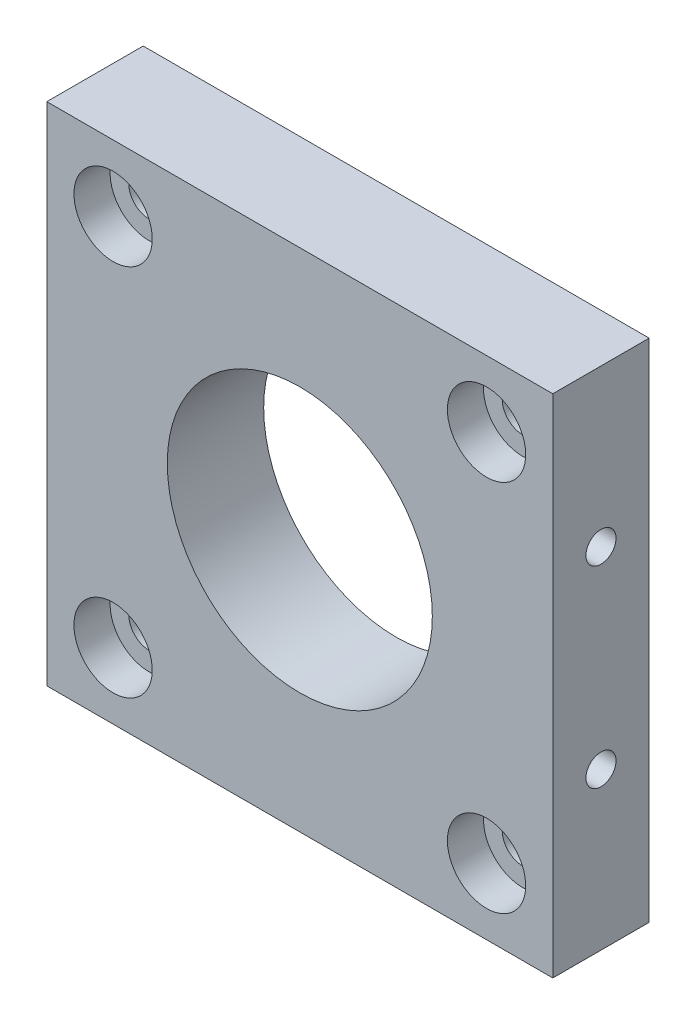
ISO-10303-21;
HEADER;
FILE_DESCRIPTION(('STEP AP214'),'2;1');
FILE_NAME('part.step','',(''),(''),'','','');
FILE_SCHEMA(('AUTOMOTIVE_DESIGN { 1 0 10303 214 1 1 1 1 }'));
ENDSEC;
DATA;
#1=APPLICATION_CONTEXT('core data for automotive mechanical design processes');
#2=APPLICATION_PROTOCOL_DEFINITION('international standard','automotive_design',2000,#1);
#3=PRODUCT_CONTEXT('',#1,'mechanical');
#4=PRODUCT('Part','Part','',(#3));
#5=PRODUCT_RELATED_PRODUCT_CATEGORY('part','',(#4));
#6=PRODUCT_DEFINITION_FORMATION('','',#4);
#7=PRODUCT_DEFINITION_CONTEXT('part definition',#1,'design');
#8=PRODUCT_DEFINITION('design','',#6,#7);
#9=PRODUCT_DEFINITION_SHAPE('','',#8);
#10=(LENGTH_UNIT() NAMED_UNIT(*) SI_UNIT(.MILLI.,.METRE.));
#11=(NAMED_UNIT(*) PLANE_ANGLE_UNIT() SI_UNIT($,.RADIAN.));
#12=(NAMED_UNIT(*) SI_UNIT($,.STERADIAN.) SOLID_ANGLE_UNIT());
#13=UNCERTAINTY_MEASURE_WITH_UNIT(LENGTH_MEASURE(1.E-05),#10,'distance_accuracy_value','');
#14=(GEOMETRIC_REPRESENTATION_CONTEXT(3) GLOBAL_UNCERTAINTY_ASSIGNED_CONTEXT((#13)) GLOBAL_UNIT_ASSIGNED_CONTEXT((#10,
#11,#12)) REPRESENTATION_CONTEXT('',''));
#15=CARTESIAN_POINT('',(0.,0.,0.));
#16=DIRECTION('',(0.,0.,1.));
#17=DIRECTION('',(1.,0.,0.));
#18=AXIS2_PLACEMENT_3D('',#15,#16,#17);
#19=CARTESIAN_POINT('',(21.,-21.,4.));
#20=DIRECTION('',(-1.,0.,0.));
#21=DIRECTION('',(0.,0.,1.));
#22=AXIS2_PLACEMENT_3D('',#19,#20,#21);
#23=PLANE('',#22);
#24=CARTESIAN_POINT('',(21.,8.,0.));
#25=DIRECTION('',(1.,0.,0.));
#26=DIRECTION('',(0.,0.,-1.));
#27=AXIS2_PLACEMENT_3D('',#24,#25,#26);
#28=CIRCLE('',#27,1.25);
#29=CARTESIAN_POINT('',(21.,8.,-1.25));
#30=VERTEX_POINT('',#29);
#31=EDGE_CURVE('E98',#30,#30,#28,.T.);
#32=ORIENTED_EDGE('',*,*,#31,.F.);
#33=EDGE_LOOP('',(#32));
#34=FACE_BOUND('',#33,.T.);
#35=CARTESIAN_POINT('',(21.,-8.,0.));
#36=DIRECTION('',(1.,0.,0.));
#37=DIRECTION('',(0.,0.,-1.));
#38=AXIS2_PLACEMENT_3D('',#35,#36,#37);
#39=CIRCLE('',#38,1.25);
#40=CARTESIAN_POINT('',(21.,-8.,-1.25));
#41=VERTEX_POINT('',#40);
#42=EDGE_CURVE('E97',#41,#41,#39,.T.);
#43=ORIENTED_EDGE('',*,*,#42,.F.);
#44=EDGE_LOOP('',(#43));
#45=FACE_BOUND('',#44,.T.);
#46=DIRECTION('',(0.,1.,0.));
#47=VECTOR('',#46,1.);
#48=CARTESIAN_POINT('',(21.,-21.,-4.));
#49=LINE('',#48,#47);
#50=CARTESIAN_POINT('',(21.,-21.,-4.));
#51=VERTEX_POINT('',#50);
#52=CARTESIAN_POINT('',(21.,21.,-4.));
#53=VERTEX_POINT('',#52);
#54=EDGE_CURVE('E160',#51,#53,#49,.T.);
#55=ORIENTED_EDGE('',*,*,#54,.T.);
#56=DIRECTION('',(0.,0.,-1.));
#57=VECTOR('',#56,1.);
#58=CARTESIAN_POINT('',(21.,21.,4.));
#59=LINE('',#58,#57);
#60=CARTESIAN_POINT('',(21.,21.,4.));
#61=VERTEX_POINT('',#60);
#62=EDGE_CURVE('E11',#61,#53,#59,.T.);
#63=ORIENTED_EDGE('',*,*,#62,.F.);
#64=DIRECTION('',(0.,1.,0.));
#65=VECTOR('',#64,1.);
#66=CARTESIAN_POINT('',(21.,-21.,4.));
#67=LINE('',#66,#65);
#68=CARTESIAN_POINT('',(21.,-21.,4.));
#69=VERTEX_POINT('',#68);
#70=EDGE_CURVE('E163',#69,#61,#67,.T.);
#71=ORIENTED_EDGE('',*,*,#70,.F.);
#72=DIRECTION('',(0.,0.,-1.));
#73=VECTOR('',#72,1.);
#74=CARTESIAN_POINT('',(21.,-21.,4.));
#75=LINE('',#74,#73);
#76=EDGE_CURVE('E169',#69,#51,#75,.T.);
#77=ORIENTED_EDGE('',*,*,#76,.T.);
#78=EDGE_LOOP('',(#55,#63,#71,#77));
#79=FACE_BOUND('',#78,.T.);
#80=ADVANCED_FACE('F33',(#34,#45,#79),#23,.F.);
#81=CARTESIAN_POINT('',(-21.,21.,4.));
#82=DIRECTION('',(0.,-1.,0.));
#83=DIRECTION('',(0.,0.,-1.));
#84=AXIS2_PLACEMENT_3D('',#81,#82,#83);
#85=PLANE('',#84);
#86=DIRECTION('',(-1.,0.,0.));
#87=VECTOR('',#86,1.);
#88=CARTESIAN_POINT('',(-21.,21.,-4.));
#89=LINE('',#88,#87);
#90=CARTESIAN_POINT('',(-21.,21.,-4.));
#91=VERTEX_POINT('',#90);
#92=EDGE_CURVE('E172',#53,#91,#89,.T.);
#93=ORIENTED_EDGE('',*,*,#92,.T.);
#94=DIRECTION('',(0.,0.,-1.));
#95=VECTOR('',#94,1.);
#96=CARTESIAN_POINT('',(-21.,21.,4.));
#97=LINE('',#96,#95);
#98=CARTESIAN_POINT('',(-21.,21.,4.));
#99=VERTEX_POINT('',#98);
#100=EDGE_CURVE('E41',#99,#91,#97,.T.);
#101=ORIENTED_EDGE('',*,*,#100,.F.);
#102=DIRECTION('',(-1.,0.,0.));
#103=VECTOR('',#102,1.);
#104=CARTESIAN_POINT('',(-21.,21.,4.));
#105=LINE('',#104,#103);
#106=EDGE_CURVE('E80',#61,#99,#105,.T.);
#107=ORIENTED_EDGE('',*,*,#106,.F.);
#108=ORIENTED_EDGE('',*,*,#62,.T.);
#109=EDGE_LOOP('',(#93,#101,#107,#108));
#110=FACE_BOUND('',#109,.T.);
#111=ADVANCED_FACE('F196',(#110),#85,.F.);
#112=CARTESIAN_POINT('',(-21.,-21.,4.));
#113=DIRECTION('',(1.,0.,0.));
#114=DIRECTION('',(0.,0.,-1.));
#115=AXIS2_PLACEMENT_3D('',#112,#113,#114);
#116=PLANE('',#115);
#117=DIRECTION('',(0.,-1.,0.));
#118=VECTOR('',#117,1.);
#119=CARTESIAN_POINT('',(-21.,-21.,-4.));
#120=LINE('',#119,#118);
#121=CARTESIAN_POINT('',(-21.,-21.,-4.));
#122=VERTEX_POINT('',#121);
#123=EDGE_CURVE('E67',#91,#122,#120,.T.);
#124=ORIENTED_EDGE('',*,*,#123,.T.);
#125=DIRECTION('',(0.,0.,-1.));
#126=VECTOR('',#125,1.);
#127=CARTESIAN_POINT('',(-21.,-21.,4.));
#128=LINE('',#127,#126);
#129=CARTESIAN_POINT('',(-21.,-21.,4.));
#130=VERTEX_POINT('',#129);
#131=EDGE_CURVE('E177',#130,#122,#128,.T.);
#132=ORIENTED_EDGE('',*,*,#131,.F.);
#133=DIRECTION('',(0.,-1.,0.));
#134=VECTOR('',#133,1.);
#135=CARTESIAN_POINT('',(-21.,-21.,4.));
#136=LINE('',#135,#134);
#137=EDGE_CURVE('E166',#99,#130,#136,.T.);
#138=ORIENTED_EDGE('',*,*,#137,.F.);
#139=ORIENTED_EDGE('',*,*,#100,.T.);
#140=EDGE_LOOP('',(#124,#132,#138,#139));
#141=FACE_BOUND('',#140,.T.);
#142=ADVANCED_FACE('F179',(#141),#116,.F.);
#143=CARTESIAN_POINT('',(-21.,-21.,4.));
#144=DIRECTION('',(0.,1.,0.));
#145=DIRECTION('',(0.,0.,1.));
#146=AXIS2_PLACEMENT_3D('',#143,#144,#145);
#147=PLANE('',#146);
#148=DIRECTION('',(1.,0.,0.));
#149=VECTOR('',#148,1.);
#150=CARTESIAN_POINT('',(-21.,-21.,-4.));
#151=LINE('',#150,#149);
#152=EDGE_CURVE('E73',#122,#51,#151,.T.);
#153=ORIENTED_EDGE('',*,*,#152,.T.);
#154=ORIENTED_EDGE('',*,*,#76,.F.);
#155=DIRECTION('',(1.,0.,0.));
#156=VECTOR('',#155,1.);
#157=CARTESIAN_POINT('',(-21.,-21.,4.));
#158=LINE('',#157,#156);
#159=EDGE_CURVE('E49',#130,#69,#158,.T.);
#160=ORIENTED_EDGE('',*,*,#159,.F.);
#161=ORIENTED_EDGE('',*,*,#131,.T.);
#162=EDGE_LOOP('',(#153,#154,#160,#161));
#163=FACE_BOUND('',#162,.T.);
#164=ADVANCED_FACE('F186',(#163),#147,.F.);
#165=CARTESIAN_POINT('',(0.,0.,4.));
#166=DIRECTION('',(0.,0.,-1.));
#167=DIRECTION('',(-1.,0.,0.));
#168=AXIS2_PLACEMENT_3D('',#165,#166,#167);
#169=PLANE('',#168);
#170=CARTESIAN_POINT('',(-15.4999999999999,-15.5000000000001,4.));
#171=DIRECTION('',(0.,0.,1.));
#172=DIRECTION('',(0.,1.,0.));
#173=AXIS2_PLACEMENT_3D('',#170,#171,#172);
#174=CIRCLE('',#173,3.25);
#175=CARTESIAN_POINT('',(-15.5,-12.2500000000001,4.));
#176=VERTEX_POINT('',#175);
#177=EDGE_CURVE('E109',#176,#176,#174,.T.);
#178=ORIENTED_EDGE('',*,*,#177,.F.);
#179=EDGE_LOOP('',(#178));
#180=FACE_BOUND('',#179,.T.);
#181=CARTESIAN_POINT('',(15.5,-15.5,4.));
#182=DIRECTION('',(0.,0.,1.));
#183=DIRECTION('',(-1.,0.,0.));
#184=AXIS2_PLACEMENT_3D('',#181,#182,#183);
#185=CIRCLE('',#184,3.25);
#186=CARTESIAN_POINT('',(12.25,-15.5,4.));
#187=VERTEX_POINT('',#186);
#188=EDGE_CURVE('E123',#187,#187,#185,.T.);
#189=ORIENTED_EDGE('',*,*,#188,.F.);
#190=EDGE_LOOP('',(#189));
#191=FACE_BOUND('',#190,.T.);
#192=CARTESIAN_POINT('',(15.4999999999998,15.5000000000002,4.));
#193=DIRECTION('',(0.,0.,1.));
#194=DIRECTION('',(0.,-1.,0.));
#195=AXIS2_PLACEMENT_3D('',#192,#193,#194);
#196=CIRCLE('',#195,3.25);
#197=CARTESIAN_POINT('',(15.4999999999999,12.2500000000002,4.));
#198=VERTEX_POINT('',#197);
#199=EDGE_CURVE('E108',#198,#198,#196,.T.);
#200=ORIENTED_EDGE('',*,*,#199,.F.);
#201=EDGE_LOOP('',(#200));
#202=FACE_BOUND('',#201,.T.);
#203=CARTESIAN_POINT('',(-15.5,15.5,4.));
#204=DIRECTION('',(0.,0.,1.));
#205=DIRECTION('',(1.,0.,0.));
#206=AXIS2_PLACEMENT_3D('',#203,#204,#205);
#207=CIRCLE('',#206,3.25);
#208=CARTESIAN_POINT('',(-12.25,15.5,4.));
#209=VERTEX_POINT('',#208);
#210=EDGE_CURVE('E122',#209,#209,#207,.T.);
#211=ORIENTED_EDGE('',*,*,#210,.F.);
#212=EDGE_LOOP('',(#211));
#213=FACE_BOUND('',#212,.T.);
#214=CARTESIAN_POINT('',(0.,0.,4.));
#215=DIRECTION('',(0.,0.,1.));
#216=DIRECTION('',(1.,0.,0.));
#217=AXIS2_PLACEMENT_3D('',#214,#215,#216);
#218=CIRCLE('',#217,11.);
#219=CARTESIAN_POINT('',(11.,0.,4.));
#220=VERTEX_POINT('',#219);
#221=EDGE_CURVE('E156',#220,#220,#218,.T.);
#222=ORIENTED_EDGE('',*,*,#221,.F.);
#223=EDGE_LOOP('',(#222));
#224=FACE_BOUND('',#223,.T.);
#225=ORIENTED_EDGE('',*,*,#70,.T.);
#226=ORIENTED_EDGE('',*,*,#106,.T.);
#227=ORIENTED_EDGE('',*,*,#137,.T.);
#228=ORIENTED_EDGE('',*,*,#159,.T.);
#229=EDGE_LOOP('',(#225,#226,#227,#228));
#230=FACE_BOUND('',#229,.T.);
#231=ADVANCED_FACE('F188',(#180,#191,#202,#213,#224,#230),#169,.F.);
#232=CARTESIAN_POINT('',(0.,0.,-4.));
#233=DIRECTION('',(0.,0.,-1.));
#234=DIRECTION('',(-1.,0.,0.));
#235=AXIS2_PLACEMENT_3D('',#232,#233,#234);
#236=PLANE('',#235);
#237=CARTESIAN_POINT('',(-15.4999999999999,-15.5000000000001,-4.));
#238=DIRECTION('',(0.,0.,1.));
#239=DIRECTION('',(0.,1.,0.));
#240=AXIS2_PLACEMENT_3D('',#237,#238,#239);
#241=CIRCLE('',#240,1.7);
#242=CARTESIAN_POINT('',(-15.5,-13.8000000000001,-4.));
#243=VERTEX_POINT('',#242);
#244=EDGE_CURVE('E112',#243,#243,#241,.T.);
#245=ORIENTED_EDGE('',*,*,#244,.T.);
#246=EDGE_LOOP('',(#245));
#247=FACE_BOUND('',#246,.T.);
#248=CARTESIAN_POINT('',(15.5,-15.5,-4.));
#249=DIRECTION('',(0.,0.,1.));
#250=DIRECTION('',(-1.,0.,0.));
#251=AXIS2_PLACEMENT_3D('',#248,#249,#250);
#252=CIRCLE('',#251,1.7);
#253=CARTESIAN_POINT('',(13.8,-15.5,-4.));
#254=VERTEX_POINT('',#253);
#255=EDGE_CURVE('E126',#254,#254,#252,.T.);
#256=ORIENTED_EDGE('',*,*,#255,.T.);
#257=EDGE_LOOP('',(#256));
#258=FACE_BOUND('',#257,.T.);
#259=CARTESIAN_POINT('',(15.4999999999998,15.5000000000002,-4.));
#260=DIRECTION('',(0.,0.,1.));
#261=DIRECTION('',(0.,-1.,0.));
#262=AXIS2_PLACEMENT_3D('',#259,#260,#261);
#263=CIRCLE('',#262,1.7);
#264=CARTESIAN_POINT('',(15.4999999999999,13.8000000000002,-4.));
#265=VERTEX_POINT('',#264);
#266=EDGE_CURVE('E137',#265,#265,#263,.T.);
#267=ORIENTED_EDGE('',*,*,#266,.T.);
#268=EDGE_LOOP('',(#267));
#269=FACE_BOUND('',#268,.T.);
#270=CARTESIAN_POINT('',(-15.5,15.5,-4.));
#271=DIRECTION('',(0.,0.,1.));
#272=DIRECTION('',(1.,0.,0.));
#273=AXIS2_PLACEMENT_3D('',#270,#271,#272);
#274=CIRCLE('',#273,1.7);
#275=CARTESIAN_POINT('',(-13.8,15.5,-4.));
#276=VERTEX_POINT('',#275);
#277=EDGE_CURVE('E153',#276,#276,#274,.T.);
#278=ORIENTED_EDGE('',*,*,#277,.T.);
#279=EDGE_LOOP('',(#278));
#280=FACE_BOUND('',#279,.T.);
#281=CARTESIAN_POINT('',(0.,0.,-4.));
#282=DIRECTION('',(0.,0.,1.));
#283=DIRECTION('',(1.,0.,0.));
#284=AXIS2_PLACEMENT_3D('',#281,#282,#283);
#285=CIRCLE('',#284,11.);
#286=CARTESIAN_POINT('',(11.,0.,-4.));
#287=VERTEX_POINT('',#286);
#288=EDGE_CURVE('E157',#287,#287,#285,.T.);
#289=ORIENTED_EDGE('',*,*,#288,.T.);
#290=EDGE_LOOP('',(#289));
#291=FACE_BOUND('',#290,.T.);
#292=ORIENTED_EDGE('',*,*,#54,.F.);
#293=ORIENTED_EDGE('',*,*,#152,.F.);
#294=ORIENTED_EDGE('',*,*,#123,.F.);
#295=ORIENTED_EDGE('',*,*,#92,.F.);
#296=EDGE_LOOP('',(#292,#293,#294,#295));
#297=FACE_BOUND('',#296,.T.);
#298=ADVANCED_FACE('F182',(#247,#258,#269,#280,#291,#297),#236,.T.);
#299=CARTESIAN_POINT('',(0.,0.,-4.));
#300=DIRECTION('',(0.,0.,1.));
#301=DIRECTION('',(1.,0.,0.));
#302=AXIS2_PLACEMENT_3D('',#299,#300,#301);
#303=CYLINDRICAL_SURFACE('',#302,11.);
#304=ORIENTED_EDGE('',*,*,#288,.F.);
#305=EDGE_LOOP('',(#304));
#306=FACE_BOUND('',#305,.T.);
#307=ORIENTED_EDGE('',*,*,#221,.T.);
#308=EDGE_LOOP('',(#307));
#309=FACE_BOUND('',#308,.T.);
#310=ADVANCED_FACE('F267',(#306,#309),#303,.F.);
#311=CARTESIAN_POINT('',(-15.5,15.5,4.));
#312=DIRECTION('',(0.,0.,1.));
#313=DIRECTION('',(1.,0.,0.));
#314=AXIS2_PLACEMENT_3D('',#311,#312,#313);
#315=CYLINDRICAL_SURFACE('',#314,1.7);
#316=ORIENTED_EDGE('',*,*,#277,.F.);
#317=EDGE_LOOP('',(#316));
#318=FACE_BOUND('',#317,.T.);
#319=CARTESIAN_POINT('',(-15.5,15.5,1.));
#320=DIRECTION('',(0.,0.,1.));
#321=DIRECTION('',(1.,0.,0.));
#322=AXIS2_PLACEMENT_3D('',#319,#320,#321);
#323=CIRCLE('',#322,1.7);
#324=CARTESIAN_POINT('',(-13.8,15.5,1.));
#325=VERTEX_POINT('',#324);
#326=EDGE_CURVE('E150',#325,#325,#323,.T.);
#327=ORIENTED_EDGE('',*,*,#326,.T.);
#328=EDGE_LOOP('',(#327));
#329=FACE_BOUND('',#328,.T.);
#330=ADVANCED_FACE('F263',(#318,#329),#315,.F.);
#331=CARTESIAN_POINT('',(-13.8,15.5,1.));
#332=DIRECTION('',(0.,0.,-1.));
#333=DIRECTION('',(-1.,0.,0.));
#334=AXIS2_PLACEMENT_3D('',#331,#332,#333);
#335=PLANE('',#334);
#336=ORIENTED_EDGE('',*,*,#326,.F.);
#337=EDGE_LOOP('',(#336));
#338=FACE_BOUND('',#337,.T.);
#339=CARTESIAN_POINT('',(-15.5,15.5,1.));
#340=DIRECTION('',(0.,0.,1.));
#341=DIRECTION('',(1.,0.,0.));
#342=AXIS2_PLACEMENT_3D('',#339,#340,#341);
#343=CIRCLE('',#342,3.25);
#344=CARTESIAN_POINT('',(-12.25,15.5,1.));
#345=VERTEX_POINT('',#344);
#346=EDGE_CURVE('E147',#345,#345,#343,.T.);
#347=ORIENTED_EDGE('',*,*,#346,.T.);
#348=EDGE_LOOP('',(#347));
#349=FACE_BOUND('',#348,.T.);
#350=ADVANCED_FACE('F259',(#338,#349),#335,.F.);
#351=CARTESIAN_POINT('',(-15.5,15.5,4.));
#352=DIRECTION('',(0.,0.,1.));
#353=DIRECTION('',(1.,0.,0.));
#354=AXIS2_PLACEMENT_3D('',#351,#352,#353);
#355=CYLINDRICAL_SURFACE('',#354,3.25);
#356=ORIENTED_EDGE('',*,*,#346,.F.);
#357=EDGE_LOOP('',(#356));
#358=FACE_BOUND('',#357,.T.);
#359=ORIENTED_EDGE('',*,*,#210,.T.);
#360=EDGE_LOOP('',(#359));
#361=FACE_BOUND('',#360,.T.);
#362=ADVANCED_FACE('F255',(#358,#361),#355,.F.);
#363=CARTESIAN_POINT('',(15.4999999999998,15.5000000000002,4.));
#364=DIRECTION('',(0.,0.,1.));
#365=DIRECTION('',(0.,-1.,0.));
#366=AXIS2_PLACEMENT_3D('',#363,#364,#365);
#367=CYLINDRICAL_SURFACE('',#366,1.7);
#368=ORIENTED_EDGE('',*,*,#266,.F.);
#369=EDGE_LOOP('',(#368));
#370=FACE_BOUND('',#369,.T.);
#371=CARTESIAN_POINT('',(15.4999999999998,15.5000000000002,1.));
#372=DIRECTION('',(0.,0.,1.));
#373=DIRECTION('',(0.,-1.,0.));
#374=AXIS2_PLACEMENT_3D('',#371,#372,#373);
#375=CIRCLE('',#374,1.7);
#376=CARTESIAN_POINT('',(15.4999999999999,13.8000000000002,1.));
#377=VERTEX_POINT('',#376);
#378=EDGE_CURVE('E127',#377,#377,#375,.T.);
#379=ORIENTED_EDGE('',*,*,#378,.T.);
#380=EDGE_LOOP('',(#379));
#381=FACE_BOUND('',#380,.T.);
#382=ADVANCED_FACE('F251',(#370,#381),#367,.F.);
#383=CARTESIAN_POINT('',(15.4999999999999,13.8000000000002,1.));
#384=DIRECTION('',(0.,0.,-1.));
#385=DIRECTION('',(0.,1.,0.));
#386=AXIS2_PLACEMENT_3D('',#383,#384,#385);
#387=PLANE('',#386);
#388=ORIENTED_EDGE('',*,*,#378,.F.);
#389=EDGE_LOOP('',(#388));
#390=FACE_BOUND('',#389,.T.);
#391=CARTESIAN_POINT('',(15.4999999999998,15.5000000000002,1.));
#392=DIRECTION('',(0.,0.,1.));
#393=DIRECTION('',(0.,-1.,0.));
#394=AXIS2_PLACEMENT_3D('',#391,#392,#393);
#395=CIRCLE('',#394,3.25);
#396=CARTESIAN_POINT('',(15.4999999999999,12.2500000000002,1.));
#397=VERTEX_POINT('',#396);
#398=EDGE_CURVE('E140',#397,#397,#395,.T.);
#399=ORIENTED_EDGE('',*,*,#398,.T.);
#400=EDGE_LOOP('',(#399));
#401=FACE_BOUND('',#400,.T.);
#402=ADVANCED_FACE('F247',(#390,#401),#387,.F.);
#403=CARTESIAN_POINT('',(15.4999999999998,15.5000000000002,4.));
#404=DIRECTION('',(0.,0.,1.));
#405=DIRECTION('',(0.,-1.,0.));
#406=AXIS2_PLACEMENT_3D('',#403,#404,#405);
#407=CYLINDRICAL_SURFACE('',#406,3.25);
#408=ORIENTED_EDGE('',*,*,#398,.F.);
#409=EDGE_LOOP('',(#408));
#410=FACE_BOUND('',#409,.T.);
#411=ORIENTED_EDGE('',*,*,#199,.T.);
#412=EDGE_LOOP('',(#411));
#413=FACE_BOUND('',#412,.T.);
#414=ADVANCED_FACE('F243',(#410,#413),#407,.F.);
#415=CARTESIAN_POINT('',(15.5,-15.5,4.));
#416=DIRECTION('',(0.,0.,1.));
#417=DIRECTION('',(-1.,0.,0.));
#418=AXIS2_PLACEMENT_3D('',#415,#416,#417);
#419=CYLINDRICAL_SURFACE('',#418,1.7);
#420=ORIENTED_EDGE('',*,*,#255,.F.);
#421=EDGE_LOOP('',(#420));
#422=FACE_BOUND('',#421,.T.);
#423=CARTESIAN_POINT('',(15.5,-15.5,1.));
#424=DIRECTION('',(0.,0.,1.));
#425=DIRECTION('',(-1.,0.,0.));
#426=AXIS2_PLACEMENT_3D('',#423,#424,#425);
#427=CIRCLE('',#426,1.7);
#428=CARTESIAN_POINT('',(13.8,-15.5,1.));
#429=VERTEX_POINT('',#428);
#430=EDGE_CURVE('E113',#429,#429,#427,.T.);
#431=ORIENTED_EDGE('',*,*,#430,.T.);
#432=EDGE_LOOP('',(#431));
#433=FACE_BOUND('',#432,.T.);
#434=ADVANCED_FACE('F239',(#422,#433),#419,.F.);
#435=CARTESIAN_POINT('',(13.8,-15.5,1.));
#436=DIRECTION('',(0.,0.,-1.));
#437=DIRECTION('',(1.,0.,0.));
#438=AXIS2_PLACEMENT_3D('',#435,#436,#437);
#439=PLANE('',#438);
#440=ORIENTED_EDGE('',*,*,#430,.F.);
#441=EDGE_LOOP('',(#440));
#442=FACE_BOUND('',#441,.T.);
#443=CARTESIAN_POINT('',(15.5,-15.5,1.));
#444=DIRECTION('',(0.,0.,1.));
#445=DIRECTION('',(-1.,0.,0.));
#446=AXIS2_PLACEMENT_3D('',#443,#444,#445);
#447=CIRCLE('',#446,3.25);
#448=CARTESIAN_POINT('',(12.25,-15.5,1.));
#449=VERTEX_POINT('',#448);
#450=EDGE_CURVE('E130',#449,#449,#447,.T.);
#451=ORIENTED_EDGE('',*,*,#450,.T.);
#452=EDGE_LOOP('',(#451));
#453=FACE_BOUND('',#452,.T.);
#454=ADVANCED_FACE('F235',(#442,#453),#439,.F.);
#455=CARTESIAN_POINT('',(15.5,-15.5,4.));
#456=DIRECTION('',(0.,0.,1.));
#457=DIRECTION('',(-1.,0.,0.));
#458=AXIS2_PLACEMENT_3D('',#455,#456,#457);
#459=CYLINDRICAL_SURFACE('',#458,3.25);
#460=ORIENTED_EDGE('',*,*,#450,.F.);
#461=EDGE_LOOP('',(#460));
#462=FACE_BOUND('',#461,.T.);
#463=ORIENTED_EDGE('',*,*,#188,.T.);
#464=EDGE_LOOP('',(#463));
#465=FACE_BOUND('',#464,.T.);
#466=ADVANCED_FACE('F231',(#462,#465),#459,.F.);
#467=CARTESIAN_POINT('',(-15.4999999999999,-15.5000000000001,4.));
#468=DIRECTION('',(0.,0.,1.));
#469=DIRECTION('',(0.,1.,0.));
#470=AXIS2_PLACEMENT_3D('',#467,#468,#469);
#471=CYLINDRICAL_SURFACE('',#470,1.7);
#472=ORIENTED_EDGE('',*,*,#244,.F.);
#473=EDGE_LOOP('',(#472));
#474=FACE_BOUND('',#473,.T.);
#475=CARTESIAN_POINT('',(-15.4999999999999,-15.5000000000001,1.));
#476=DIRECTION('',(0.,0.,1.));
#477=DIRECTION('',(0.,1.,0.));
#478=AXIS2_PLACEMENT_3D('',#475,#476,#477);
#479=CIRCLE('',#478,1.7);
#480=CARTESIAN_POINT('',(-15.5,-13.8000000000001,1.));
#481=VERTEX_POINT('',#480);
#482=EDGE_CURVE('E119',#481,#481,#479,.T.);
#483=ORIENTED_EDGE('',*,*,#482,.T.);
#484=EDGE_LOOP('',(#483));
#485=FACE_BOUND('',#484,.T.);
#486=ADVANCED_FACE('F227',(#474,#485),#471,.F.);
#487=CARTESIAN_POINT('',(-15.5,-13.8000000000001,1.));
#488=DIRECTION('',(0.,0.,-1.));
#489=DIRECTION('',(0.,-1.,0.));
#490=AXIS2_PLACEMENT_3D('',#487,#488,#489);
#491=PLANE('',#490);
#492=ORIENTED_EDGE('',*,*,#482,.F.);
#493=EDGE_LOOP('',(#492));
#494=FACE_BOUND('',#493,.T.);
#495=CARTESIAN_POINT('',(-15.4999999999999,-15.5000000000001,1.));
#496=DIRECTION('',(0.,0.,1.));
#497=DIRECTION('',(0.,1.,0.));
#498=AXIS2_PLACEMENT_3D('',#495,#496,#497);
#499=CIRCLE('',#498,3.25);
#500=CARTESIAN_POINT('',(-15.5,-12.2500000000001,1.));
#501=VERTEX_POINT('',#500);
#502=EDGE_CURVE('E116',#501,#501,#499,.T.);
#503=ORIENTED_EDGE('',*,*,#502,.T.);
#504=EDGE_LOOP('',(#503));
#505=FACE_BOUND('',#504,.T.);
#506=ADVANCED_FACE('F223',(#494,#505),#491,.F.);
#507=CARTESIAN_POINT('',(-15.4999999999999,-15.5000000000001,4.));
#508=DIRECTION('',(0.,0.,1.));
#509=DIRECTION('',(0.,1.,0.));
#510=AXIS2_PLACEMENT_3D('',#507,#508,#509);
#511=CYLINDRICAL_SURFACE('',#510,3.25);
#512=ORIENTED_EDGE('',*,*,#502,.F.);
#513=EDGE_LOOP('',(#512));
#514=FACE_BOUND('',#513,.T.);
#515=ORIENTED_EDGE('',*,*,#177,.T.);
#516=EDGE_LOOP('',(#515));
#517=FACE_BOUND('',#516,.T.);
#518=ADVANCED_FACE('F215',(#514,#517),#511,.F.);
#519=CARTESIAN_POINT('',(11.,-8.,0.));
#520=DIRECTION('',(1.,0.,0.));
#521=DIRECTION('',(0.,0.,-1.));
#522=AXIS2_PLACEMENT_3D('',#519,#520,#521);
#523=CONICAL_SURFACE('',#522,1.25,1.02974425867665);
#524=CARTESIAN_POINT('',(10.2489242262155,-8.,0.));
#525=VERTEX_POINT('',#524);
#526=VERTEX_LOOP('',#525);
#527=FACE_BOUND('',#526,.T.);
#528=CARTESIAN_POINT('',(11.,-8.,0.));
#529=DIRECTION('',(1.,0.,0.));
#530=DIRECTION('',(0.,0.,-1.));
#531=AXIS2_PLACEMENT_3D('',#528,#529,#530);
#532=CIRCLE('',#531,1.25);
#533=CARTESIAN_POINT('',(11.,-8.,-1.25));
#534=VERTEX_POINT('',#533);
#535=EDGE_CURVE('E101',#534,#534,#532,.T.);
#536=ORIENTED_EDGE('',*,*,#535,.T.);
#537=EDGE_LOOP('',(#536));
#538=FACE_BOUND('',#537,.T.);
#539=ADVANCED_FACE('F209',(#527,#538),#523,.F.);
#540=CARTESIAN_POINT('',(21.,-8.,0.));
#541=DIRECTION('',(1.,0.,0.));
#542=DIRECTION('',(0.,0.,-1.));
#543=AXIS2_PLACEMENT_3D('',#540,#541,#542);
#544=CYLINDRICAL_SURFACE('',#543,1.25);
#545=ORIENTED_EDGE('',*,*,#535,.F.);
#546=EDGE_LOOP('',(#545));
#547=FACE_BOUND('',#546,.T.);
#548=ORIENTED_EDGE('',*,*,#42,.T.);
#549=EDGE_LOOP('',(#548));
#550=FACE_BOUND('',#549,.T.);
#551=ADVANCED_FACE('F91',(#547,#550),#544,.F.);
#552=CARTESIAN_POINT('',(11.,8.,0.));
#553=DIRECTION('',(1.,0.,0.));
#554=DIRECTION('',(0.,0.,-1.));
#555=AXIS2_PLACEMENT_3D('',#552,#553,#554);
#556=CONICAL_SURFACE('',#555,1.25,1.02974425867665);
#557=CARTESIAN_POINT('',(10.2489242262155,8.,0.));
#558=VERTEX_POINT('',#557);
#559=VERTEX_LOOP('',#558);
#560=FACE_BOUND('',#559,.T.);
#561=CARTESIAN_POINT('',(11.,8.,0.));
#562=DIRECTION('',(1.,0.,0.));
#563=DIRECTION('',(0.,0.,-1.));
#564=AXIS2_PLACEMENT_3D('',#561,#562,#563);
#565=CIRCLE('',#564,1.25);
#566=CARTESIAN_POINT('',(11.,8.,-1.25));
#567=VERTEX_POINT('',#566);
#568=EDGE_CURVE('E95',#567,#567,#565,.T.);
#569=ORIENTED_EDGE('',*,*,#568,.T.);
#570=EDGE_LOOP('',(#569));
#571=FACE_BOUND('',#570,.T.);
#572=ADVANCED_FACE('F87',(#560,#571),#556,.F.);
#573=CARTESIAN_POINT('',(21.,8.,0.));
#574=DIRECTION('',(1.,0.,0.));
#575=DIRECTION('',(0.,0.,-1.));
#576=AXIS2_PLACEMENT_3D('',#573,#574,#575);
#577=CYLINDRICAL_SURFACE('',#576,1.25);
#578=ORIENTED_EDGE('',*,*,#568,.F.);
#579=EDGE_LOOP('',(#578));
#580=FACE_BOUND('',#579,.T.);
#581=ORIENTED_EDGE('',*,*,#31,.T.);
#582=EDGE_LOOP('',(#581));
#583=FACE_BOUND('',#582,.T.);
#584=ADVANCED_FACE('F90',(#580,#583),#577,.F.);
#585=CLOSED_SHELL('',(#80,#111,#142,#164,#231,#298,#310,#330,#350,#362,#382,#402,#414,#434,#454,
#466,#486,#506,#518,#539,#551,#572,#584));
#586=MANIFOLD_SOLID_BREP('B2',#585);
#587=ADVANCED_BREP_SHAPE_REPRESENTATION('',(#18,#586),#14);
#588=SHAPE_DEFINITION_REPRESENTATION(#9,#587);
ENDSEC;
END-ISO-10303-21;
